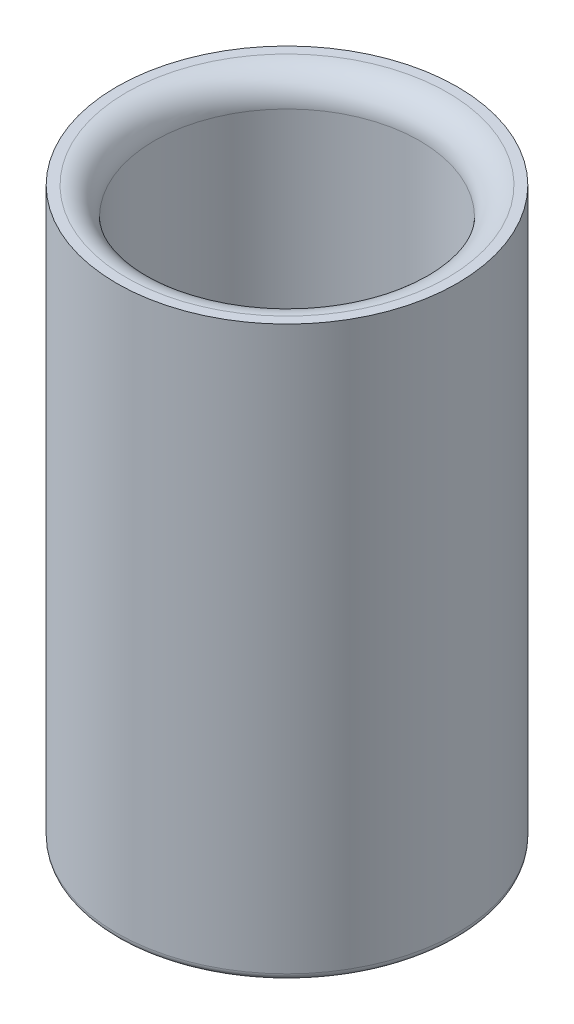
ISO-10303-21;
HEADER;
FILE_DESCRIPTION(('STEP AP214'),'2;1');
FILE_NAME('part.step','',(''),(''),'','','');
FILE_SCHEMA(('AUTOMOTIVE_DESIGN { 1 0 10303 214 1 1 1 1 }'));
ENDSEC;
DATA;
#1=APPLICATION_CONTEXT('core data for automotive mechanical design processes');
#2=APPLICATION_PROTOCOL_DEFINITION('international standard','automotive_design',2000,#1);
#3=PRODUCT_CONTEXT('',#1,'mechanical');
#4=PRODUCT('Part','Part','',(#3));
#5=PRODUCT_RELATED_PRODUCT_CATEGORY('part','',(#4));
#6=PRODUCT_DEFINITION_FORMATION('','',#4);
#7=PRODUCT_DEFINITION_CONTEXT('part definition',#1,'design');
#8=PRODUCT_DEFINITION('design','',#6,#7);
#9=PRODUCT_DEFINITION_SHAPE('','',#8);
#10=(LENGTH_UNIT() NAMED_UNIT(*) SI_UNIT(.MILLI.,.METRE.));
#11=(NAMED_UNIT(*) PLANE_ANGLE_UNIT() SI_UNIT($,.RADIAN.));
#12=(NAMED_UNIT(*) SI_UNIT($,.STERADIAN.) SOLID_ANGLE_UNIT());
#13=UNCERTAINTY_MEASURE_WITH_UNIT(LENGTH_MEASURE(1.E-05),#10,'distance_accuracy_value','');
#14=(GEOMETRIC_REPRESENTATION_CONTEXT(3) GLOBAL_UNCERTAINTY_ASSIGNED_CONTEXT((#13)) GLOBAL_UNIT_ASSIGNED_CONTEXT((#10,
#11,#12)) REPRESENTATION_CONTEXT('',''));
#15=CARTESIAN_POINT('',(0.,0.,0.));
#16=DIRECTION('',(0.,0.,1.));
#17=DIRECTION('',(1.,0.,0.));
#18=AXIS2_PLACEMENT_3D('',#15,#16,#17);
#19=CARTESIAN_POINT('',(0.,-46.2236025630672,0.));
#20=DIRECTION('',(0.,1.,0.));
#21=DIRECTION('',(-1.,0.,0.));
#22=AXIS2_PLACEMENT_3D('',#19,#20,#21);
#23=PLANE('',#22);
#24=CARTESIAN_POINT('',(0.,-46.2236025630672,0.));
#25=DIRECTION('',(0.,1.,0.));
#26=DIRECTION('',(-1.,0.,0.));
#27=AXIS2_PLACEMENT_3D('',#24,#25,#26);
#28=CIRCLE('',#27,11.54);
#29=CARTESIAN_POINT('',(-11.54,-46.2236025630672,0.));
#30=VERTEX_POINT('',#29);
#31=EDGE_CURVE('E10',#30,#30,#28,.T.);
#32=ORIENTED_EDGE('',*,*,#31,.T.);
#33=EDGE_LOOP('',(#32));
#34=FACE_BOUND('',#33,.T.);
#35=ADVANCED_FACE('F32',(#34),#23,.T.);
#36=CARTESIAN_POINT('',(0.,-46.2236025630672,0.));
#37=DIRECTION('',(0.,1.,0.));
#38=DIRECTION('',(-1.,0.,0.));
#39=AXIS2_PLACEMENT_3D('',#36,#37,#38);
#40=CONICAL_SURFACE('',#39,11.54,1.48352986419518);
#41=CARTESIAN_POINT('',(0.,-45.6490508839676,0.));
#42=DIRECTION('',(0.,1.,0.));
#43=DIRECTION('',(-1.,0.,0.));
#44=AXIS2_PLACEMENT_3D('',#41,#42,#43);
#45=CIRCLE('',#44,18.1071557427477);
#46=CARTESIAN_POINT('',(-18.1071557427476,-45.6490508839676,0.));
#47=VERTEX_POINT('',#46);
#48=EDGE_CURVE('E38',#47,#47,#45,.T.);
#49=ORIENTED_EDGE('',*,*,#48,.T.);
#50=EDGE_LOOP('',(#49));
#51=FACE_BOUND('',#50,.T.);
#52=ORIENTED_EDGE('',*,*,#31,.F.);
#53=EDGE_LOOP('',(#52));
#54=FACE_BOUND('',#53,.T.);
#55=ADVANCED_FACE('F76',(#51,#54),#40,.F.);
#56=CARTESIAN_POINT('',(0.,-44.6528561858758,0.));
#57=DIRECTION('',(0.,1.,0.));
#58=DIRECTION('',(-1.,0.,0.));
#59=AXIS2_PLACEMENT_3D('',#56,#57,#58);
#60=TOROIDAL_SURFACE('',#59,18.02,1.00000000000001);
#61=CARTESIAN_POINT('',(0.,-44.6528561858758,0.));
#62=DIRECTION('',(0.,1.,0.));
#63=DIRECTION('',(-1.,0.,0.));
#64=AXIS2_PLACEMENT_3D('',#61,#62,#63);
#65=CIRCLE('',#64,19.02);
#66=CARTESIAN_POINT('',(-19.02,-44.6528561858758,0.));
#67=VERTEX_POINT('',#66);
#68=EDGE_CURVE('E42',#67,#67,#65,.T.);
#69=ORIENTED_EDGE('',*,*,#68,.T.);
#70=EDGE_LOOP('',(#69));
#71=FACE_BOUND('',#70,.T.);
#72=ORIENTED_EDGE('',*,*,#48,.F.);
#73=EDGE_LOOP('',(#72));
#74=FACE_BOUND('',#73,.T.);
#75=ADVANCED_FACE('F80',(#71,#74),#60,.F.);
#76=CARTESIAN_POINT('',(0.,49.5411281489595,0.));
#77=DIRECTION('',(0.,1.,0.));
#78=DIRECTION('',(-1.,0.,0.));
#79=AXIS2_PLACEMENT_3D('',#76,#77,#78);
#80=CYLINDRICAL_SURFACE('',#79,19.02);
#81=CARTESIAN_POINT('',(0.,22.5163974369328,0.));
#82=DIRECTION('',(0.,1.,0.));
#83=DIRECTION('',(-1.,0.,0.));
#84=AXIS2_PLACEMENT_3D('',#81,#82,#83);
#85=CIRCLE('',#84,19.02);
#86=CARTESIAN_POINT('',(-19.02,22.5163974369328,0.));
#87=VERTEX_POINT('',#86);
#88=EDGE_CURVE('E46',#87,#87,#85,.T.);
#89=ORIENTED_EDGE('',*,*,#88,.T.);
#90=EDGE_LOOP('',(#89));
#91=FACE_BOUND('',#90,.T.);
#92=ORIENTED_EDGE('',*,*,#68,.F.);
#93=EDGE_LOOP('',(#92));
#94=FACE_BOUND('',#93,.T.);
#95=ADVANCED_FACE('F84',(#91,#94),#80,.F.);
#96=CARTESIAN_POINT('',(0.,22.5163974369328,0.));
#97=DIRECTION('',(0.,1.,0.));
#98=DIRECTION('',(-1.,0.,0.));
#99=AXIS2_PLACEMENT_3D('',#96,#97,#98);
#100=TOROIDAL_SURFACE('',#99,23.02,4.);
#101=CARTESIAN_POINT('',(0.,26.5163974369328,0.));
#102=DIRECTION('',(0.,1.,0.));
#103=DIRECTION('',(-1.,0.,0.));
#104=AXIS2_PLACEMENT_3D('',#101,#102,#103);
#105=CIRCLE('',#104,23.02);
#106=CARTESIAN_POINT('',(-23.02,26.5163974369328,0.));
#107=VERTEX_POINT('',#106);
#108=EDGE_CURVE('E51',#107,#107,#105,.T.);
#109=ORIENTED_EDGE('',*,*,#108,.T.);
#110=EDGE_LOOP('',(#109));
#111=FACE_BOUND('',#110,.T.);
#112=ORIENTED_EDGE('',*,*,#88,.F.);
#113=EDGE_LOOP('',(#112));
#114=FACE_BOUND('',#113,.T.);
#115=ADVANCED_FACE('F91',(#111,#114),#100,.T.);
#116=CARTESIAN_POINT('',(-24.425,26.5163974369328,0.));
#117=DIRECTION('',(0.,1.,0.));
#118=DIRECTION('',(-1.,0.,0.));
#119=AXIS2_PLACEMENT_3D('',#116,#117,#118);
#120=PLANE('',#119);
#121=CARTESIAN_POINT('',(0.,26.5163974369328,0.));
#122=DIRECTION('',(0.,1.,0.));
#123=DIRECTION('',(-1.,0.,0.));
#124=AXIS2_PLACEMENT_3D('',#121,#122,#123);
#125=CIRCLE('',#124,24.425);
#126=CARTESIAN_POINT('',(-24.425,26.5163974369328,0.));
#127=VERTEX_POINT('',#126);
#128=EDGE_CURVE('E54',#127,#127,#125,.T.);
#129=ORIENTED_EDGE('',*,*,#128,.T.);
#130=EDGE_LOOP('',(#129));
#131=FACE_BOUND('',#130,.T.);
#132=ORIENTED_EDGE('',*,*,#108,.F.);
#133=EDGE_LOOP('',(#132));
#134=FACE_BOUND('',#133,.T.);
#135=ADVANCED_FACE('F95',(#131,#134),#120,.T.);
#136=CARTESIAN_POINT('',(0.,49.5411281489595,0.));
#137=DIRECTION('',(0.,1.,0.));
#138=DIRECTION('',(-1.,0.,0.));
#139=AXIS2_PLACEMENT_3D('',#136,#137,#138);
#140=CYLINDRICAL_SURFACE('',#139,24.425);
#141=CARTESIAN_POINT('',(0.,-54.1836025630672,0.));
#142=DIRECTION('',(0.,1.,0.));
#143=DIRECTION('',(-1.,0.,0.));
#144=AXIS2_PLACEMENT_3D('',#141,#142,#143);
#145=CIRCLE('',#144,24.425);
#146=CARTESIAN_POINT('',(-24.425,-54.1836025630672,0.));
#147=VERTEX_POINT('',#146);
#148=EDGE_CURVE('E57',#147,#147,#145,.T.);
#149=ORIENTED_EDGE('',*,*,#148,.T.);
#150=EDGE_LOOP('',(#149));
#151=FACE_BOUND('',#150,.T.);
#152=ORIENTED_EDGE('',*,*,#128,.F.);
#153=EDGE_LOOP('',(#152));
#154=FACE_BOUND('',#153,.T.);
#155=ADVANCED_FACE('F73',(#151,#154),#140,.T.);
#156=CARTESIAN_POINT('',(0.,-54.1836025630672,0.));
#157=DIRECTION('',(0.,1.,0.));
#158=DIRECTION('',(-1.,0.,0.));
#159=AXIS2_PLACEMENT_3D('',#156,#157,#158);
#160=TOROIDAL_SURFACE('',#159,23.425,0.999999999999996);
#161=CARTESIAN_POINT('',(0.,-55.1836025630672,0.));
#162=DIRECTION('',(0.,1.,0.));
#163=DIRECTION('',(-1.,0.,0.));
#164=AXIS2_PLACEMENT_3D('',#161,#162,#163);
#165=CIRCLE('',#164,23.425);
#166=CARTESIAN_POINT('',(-23.425,-55.1836025630672,0.));
#167=VERTEX_POINT('',#166);
#168=EDGE_CURVE('E60',#167,#167,#165,.T.);
#169=ORIENTED_EDGE('',*,*,#168,.T.);
#170=EDGE_LOOP('',(#169));
#171=FACE_BOUND('',#170,.T.);
#172=ORIENTED_EDGE('',*,*,#148,.F.);
#173=EDGE_LOOP('',(#172));
#174=FACE_BOUND('',#173,.T.);
#175=ADVANCED_FACE('F64',(#171,#174),#160,.T.);
#176=CARTESIAN_POINT('',(0.,-55.1836025630672,0.));
#177=DIRECTION('',(0.,-1.,0.));
#178=DIRECTION('',(1.,0.,0.));
#179=AXIS2_PLACEMENT_3D('',#176,#177,#178);
#180=PLANE('',#179);
#181=ORIENTED_EDGE('',*,*,#168,.F.);
#182=EDGE_LOOP('',(#181));
#183=FACE_BOUND('',#182,.T.);
#184=ADVANCED_FACE('F67',(#183),#180,.T.);
#185=CLOSED_SHELL('',(#35,#55,#75,#95,#115,#135,#155,#175,#184));
#186=MANIFOLD_SOLID_BREP('B2',#185);
#187=ADVANCED_BREP_SHAPE_REPRESENTATION('',(#18,#186),#14);
#188=SHAPE_DEFINITION_REPRESENTATION(#9,#187);
ENDSEC;
END-ISO-10303-21;
